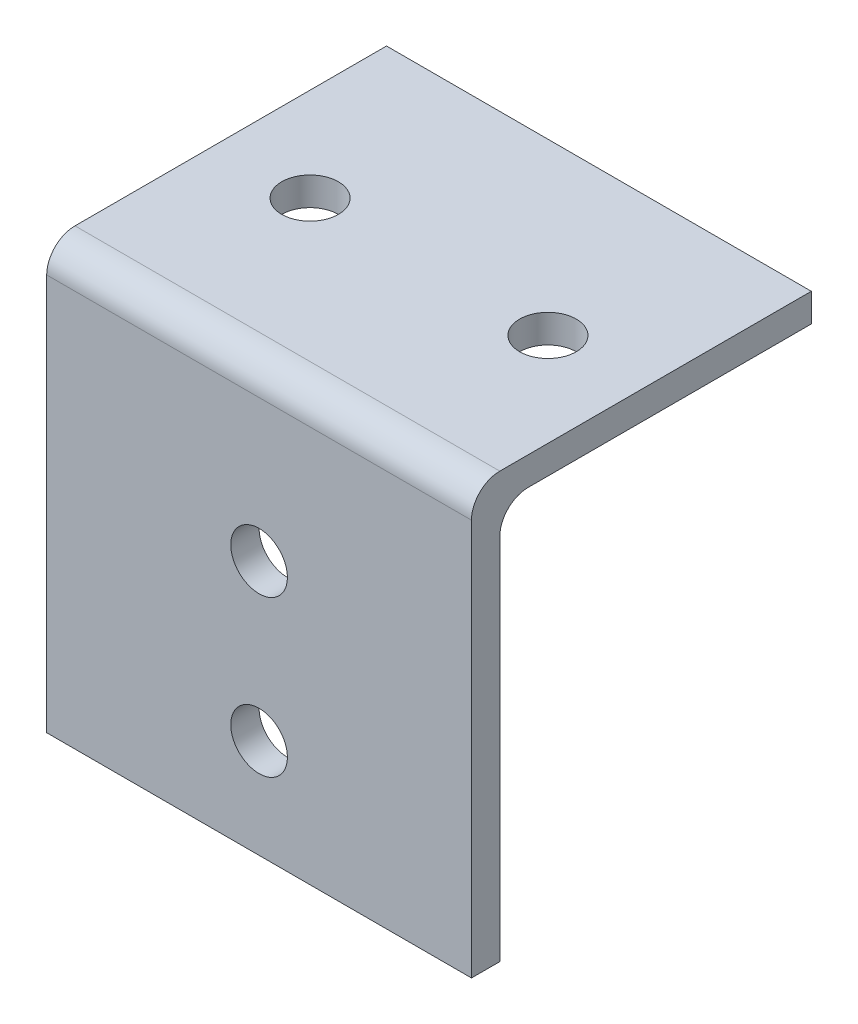
ISO-10303-21;
HEADER;
FILE_DESCRIPTION(('STEP AP214'),'2;1');
FILE_NAME('part.step','',(''),(''),'','','');
FILE_SCHEMA(('AUTOMOTIVE_DESIGN { 1 0 10303 214 1 1 1 1 }'));
ENDSEC;
DATA;
#1=APPLICATION_CONTEXT('core data for automotive mechanical design processes');
#2=APPLICATION_PROTOCOL_DEFINITION('international standard','automotive_design',2000,#1);
#3=PRODUCT_CONTEXT('',#1,'mechanical');
#4=PRODUCT('Part','Part','',(#3));
#5=PRODUCT_RELATED_PRODUCT_CATEGORY('part','',(#4));
#6=PRODUCT_DEFINITION_FORMATION('','',#4);
#7=PRODUCT_DEFINITION_CONTEXT('part definition',#1,'design');
#8=PRODUCT_DEFINITION('design','',#6,#7);
#9=PRODUCT_DEFINITION_SHAPE('','',#8);
#10=(LENGTH_UNIT() NAMED_UNIT(*) SI_UNIT(.MILLI.,.METRE.));
#11=(NAMED_UNIT(*) PLANE_ANGLE_UNIT() SI_UNIT($,.RADIAN.));
#12=(NAMED_UNIT(*) SI_UNIT($,.STERADIAN.) SOLID_ANGLE_UNIT());
#13=UNCERTAINTY_MEASURE_WITH_UNIT(LENGTH_MEASURE(1.E-05),#10,'distance_accuracy_value','');
#14=(GEOMETRIC_REPRESENTATION_CONTEXT(3) GLOBAL_UNCERTAINTY_ASSIGNED_CONTEXT((#13)) GLOBAL_UNIT_ASSIGNED_CONTEXT((#10,
#11,#12)) REPRESENTATION_CONTEXT('',''));
#15=CARTESIAN_POINT('',(0.,0.,0.));
#16=DIRECTION('',(0.,0.,1.));
#17=DIRECTION('',(1.,0.,0.));
#18=AXIS2_PLACEMENT_3D('',#15,#16,#17);
#19=CARTESIAN_POINT('',(0.,2.54,0.));
#20=DIRECTION('',(0.,1.,0.));
#21=DIRECTION('',(0.,0.,1.));
#22=AXIS2_PLACEMENT_3D('',#19,#20,#21);
#23=PLANE('',#22);
#24=CARTESIAN_POINT('',(-11.2013640387052,2.54,1.00923186480965));
#25=DIRECTION('',(0.,1.,0.));
#26=DIRECTION('',(0.,0.,1.));
#27=AXIS2_PLACEMENT_3D('',#24,#25,#26);
#28=CIRCLE('',#27,2.54);
#29=CARTESIAN_POINT('',(-11.2013640387052,2.54,3.54923186480965));
#30=VERTEX_POINT('',#29);
#31=EDGE_CURVE('E136',#30,#30,#28,.T.);
#32=ORIENTED_EDGE('',*,*,#31,.F.);
#33=EDGE_LOOP('',(#32));
#34=FACE_BOUND('',#33,.T.);
#35=DIRECTION('',(0.,0.,1.));
#36=VECTOR('',#35,1.);
#37=CARTESIAN_POINT('',(-19.5833640387052,2.54,-14.2307681351903));
#38=LINE('',#37,#36);
#39=CARTESIAN_POINT('',(-19.5833640387052,2.54,-14.2307681351903));
#40=VERTEX_POINT('',#39);
#41=CARTESIAN_POINT('',(-19.5833640387052,2.54,13.7092318648097));
#42=VERTEX_POINT('',#41);
#43=EDGE_CURVE('E147',#40,#42,#38,.T.);
#44=ORIENTED_EDGE('',*,*,#43,.T.);
#45=DIRECTION('',(-1.,0.,0.));
#46=VECTOR('',#45,1.);
#47=CARTESIAN_POINT('',(0.,2.54,13.7092318648097));
#48=LINE('',#47,#46);
#49=CARTESIAN_POINT('',(18.5166359612948,2.54,13.7092318648097));
#50=VERTEX_POINT('',#49);
#51=EDGE_CURVE('E45',#42,#50,#48,.F.);
#52=ORIENTED_EDGE('',*,*,#51,.T.);
#53=DIRECTION('',(0.,0.,-1.));
#54=VECTOR('',#53,1.);
#55=CARTESIAN_POINT('',(18.5166359612948,2.54,-14.2307681351903));
#56=LINE('',#55,#54);
#57=CARTESIAN_POINT('',(18.5166359612948,2.54,-14.2307681351903));
#58=VERTEX_POINT('',#57);
#59=EDGE_CURVE('E142',#50,#58,#56,.T.);
#60=ORIENTED_EDGE('',*,*,#59,.T.);
#61=DIRECTION('',(-1.,0.,0.));
#62=VECTOR('',#61,1.);
#63=CARTESIAN_POINT('',(5.08,2.54,-14.2307681351903));
#64=LINE('',#63,#62);
#65=EDGE_CURVE('E144',#58,#40,#64,.T.);
#66=ORIENTED_EDGE('',*,*,#65,.T.);
#67=EDGE_LOOP('',(#44,#52,#60,#66));
#68=FACE_BOUND('',#67,.T.);
#69=CARTESIAN_POINT('',(10.1346359612948,2.54,1.00923186480966));
#70=DIRECTION('',(0.,1.,0.));
#71=DIRECTION('',(0.,0.,1.));
#72=AXIS2_PLACEMENT_3D('',#69,#70,#71);
#73=CIRCLE('',#72,2.54);
#74=CARTESIAN_POINT('',(10.1346359612948,2.54,3.54923186480966));
#75=VERTEX_POINT('',#74);
#76=EDGE_CURVE('E128',#75,#75,#73,.T.);
#77=ORIENTED_EDGE('',*,*,#76,.F.);
#78=EDGE_LOOP('',(#77));
#79=FACE_BOUND('',#78,.T.);
#80=ADVANCED_FACE('F37',(#34,#68,#79),#23,.T.);
#81=CARTESIAN_POINT('',(0.,0.,0.));
#82=DIRECTION('',(0.,1.,0.));
#83=DIRECTION('',(0.,0.,1.));
#84=AXIS2_PLACEMENT_3D('',#81,#82,#83);
#85=PLANE('',#84);
#86=DIRECTION('',(0.,0.,-1.));
#87=VECTOR('',#86,1.);
#88=CARTESIAN_POINT('',(18.5166359612948,0.,-14.2307681351903));
#89=LINE('',#88,#87);
#90=CARTESIAN_POINT('',(18.5166359612948,0.,11.1692318648097));
#91=VERTEX_POINT('',#90);
#92=CARTESIAN_POINT('',(18.5166359612948,0.,-14.2307681351903));
#93=VERTEX_POINT('',#92);
#94=EDGE_CURVE('E139',#91,#93,#89,.T.);
#95=ORIENTED_EDGE('',*,*,#94,.F.);
#96=DIRECTION('',(1.,0.,0.));
#97=VECTOR('',#96,1.);
#98=CARTESIAN_POINT('',(-19.5833640387052,0.,11.1692318648097));
#99=LINE('',#98,#97);
#100=CARTESIAN_POINT('',(-19.5833640387052,0.,11.1692318648097));
#101=VERTEX_POINT('',#100);
#102=EDGE_CURVE('E163',#91,#101,#99,.F.);
#103=ORIENTED_EDGE('',*,*,#102,.T.);
#104=DIRECTION('',(0.,0.,1.));
#105=VECTOR('',#104,1.);
#106=CARTESIAN_POINT('',(-19.5833640387052,0.,-14.2307681351903));
#107=LINE('',#106,#105);
#108=CARTESIAN_POINT('',(-19.5833640387052,0.,-14.2307681351903));
#109=VERTEX_POINT('',#108);
#110=EDGE_CURVE('E145',#109,#101,#107,.T.);
#111=ORIENTED_EDGE('',*,*,#110,.F.);
#112=DIRECTION('',(-1.,0.,0.));
#113=VECTOR('',#112,1.);
#114=CARTESIAN_POINT('',(-19.5833640387052,0.,-14.2307681351903));
#115=LINE('',#114,#113);
#116=EDGE_CURVE('E151',#93,#109,#115,.T.);
#117=ORIENTED_EDGE('',*,*,#116,.F.);
#118=EDGE_LOOP('',(#95,#103,#111,#117));
#119=FACE_BOUND('',#118,.T.);
#120=CARTESIAN_POINT('',(-11.2013640387052,0.,1.00923186480965));
#121=DIRECTION('',(0.,1.,0.));
#122=DIRECTION('',(0.,0.,1.));
#123=AXIS2_PLACEMENT_3D('',#120,#121,#122);
#124=CIRCLE('',#123,2.54);
#125=CARTESIAN_POINT('',(-11.2013640387052,0.,3.54923186480965));
#126=VERTEX_POINT('',#125);
#127=EDGE_CURVE('E134',#126,#126,#124,.T.);
#128=ORIENTED_EDGE('',*,*,#127,.T.);
#129=EDGE_LOOP('',(#128));
#130=FACE_BOUND('',#129,.T.);
#131=CARTESIAN_POINT('',(10.1346359612948,0.,1.00923186480966));
#132=DIRECTION('',(0.,1.,0.));
#133=DIRECTION('',(0.,0.,1.));
#134=AXIS2_PLACEMENT_3D('',#131,#132,#133);
#135=CIRCLE('',#134,2.54);
#136=CARTESIAN_POINT('',(10.1346359612948,0.,3.54923186480966));
#137=VERTEX_POINT('',#136);
#138=EDGE_CURVE('E125',#137,#137,#135,.T.);
#139=ORIENTED_EDGE('',*,*,#138,.T.);
#140=EDGE_LOOP('',(#139));
#141=FACE_BOUND('',#140,.T.);
#142=ADVANCED_FACE('F189',(#119,#130,#141),#85,.F.);
#143=CARTESIAN_POINT('',(18.5166359612948,2.54,-14.2307681351903));
#144=DIRECTION('',(-1.,0.,0.));
#145=DIRECTION('',(0.,0.,1.));
#146=AXIS2_PLACEMENT_3D('',#143,#144,#145);
#147=PLANE('',#146);
#148=ORIENTED_EDGE('',*,*,#59,.F.);
#149=CARTESIAN_POINT('',(18.5166359612948,0.,13.7092318648097));
#150=DIRECTION('',(-1.,0.,0.));
#151=DIRECTION('',(0.,0.,1.));
#152=AXIS2_PLACEMENT_3D('',#149,#150,#151);
#153=CIRCLE('',#152,2.54);
#154=CARTESIAN_POINT('',(18.5166359612948,0.,16.2492318648097));
#155=VERTEX_POINT('',#154);
#156=EDGE_CURVE('E11',#50,#155,#153,.F.);
#157=ORIENTED_EDGE('',*,*,#156,.T.);
#158=DIRECTION('',(0.,1.,0.));
#159=VECTOR('',#158,1.);
#160=CARTESIAN_POINT('',(18.5166359612948,2.54,16.2492318648097));
#161=LINE('',#160,#159);
#162=CARTESIAN_POINT('',(18.5166359612948,-35.56,16.2492318648097));
#163=VERTEX_POINT('',#162);
#164=EDGE_CURVE('E119',#163,#155,#161,.T.);
#165=ORIENTED_EDGE('',*,*,#164,.F.);
#166=DIRECTION('',(0.,0.,-1.));
#167=VECTOR('',#166,1.);
#168=CARTESIAN_POINT('',(18.5166359612948,-35.56,16.2492318648097));
#169=LINE('',#168,#167);
#170=CARTESIAN_POINT('',(18.5166359612948,-35.56,13.7092318648097));
#171=VERTEX_POINT('',#170);
#172=EDGE_CURVE('E117',#163,#171,#169,.T.);
#173=ORIENTED_EDGE('',*,*,#172,.T.);
#174=DIRECTION('',(0.,1.,0.));
#175=VECTOR('',#174,1.);
#176=CARTESIAN_POINT('',(18.5166359612948,2.54,13.7092318648097));
#177=LINE('',#176,#175);
#178=CARTESIAN_POINT('',(18.5166359612948,-2.54,13.7092318648097));
#179=VERTEX_POINT('',#178);
#180=EDGE_CURVE('E110',#171,#179,#177,.T.);
#181=ORIENTED_EDGE('',*,*,#180,.T.);
#182=CARTESIAN_POINT('',(18.5166359612948,-2.54,11.1692318648097));
#183=DIRECTION('',(-1.,0.,0.));
#184=DIRECTION('',(0.,0.,1.));
#185=AXIS2_PLACEMENT_3D('',#182,#183,#184);
#186=CIRCLE('',#185,2.54);
#187=EDGE_CURVE('E165',#179,#91,#186,.T.);
#188=ORIENTED_EDGE('',*,*,#187,.T.);
#189=ORIENTED_EDGE('',*,*,#94,.T.);
#190=DIRECTION('',(0.,-1.,0.));
#191=VECTOR('',#190,1.);
#192=CARTESIAN_POINT('',(18.5166359612948,2.54,-14.2307681351903));
#193=LINE('',#192,#191);
#194=EDGE_CURVE('E157',#58,#93,#193,.T.);
#195=ORIENTED_EDGE('',*,*,#194,.F.);
#196=EDGE_LOOP('',(#148,#157,#165,#173,#181,#188,#189,#195));
#197=FACE_BOUND('',#196,.T.);
#198=ADVANCED_FACE('F185',(#197),#147,.F.);
#199=CARTESIAN_POINT('',(-19.5833640387052,2.54,-14.2307681351903));
#200=DIRECTION('',(0.,0.,1.));
#201=DIRECTION('',(1.,0.,0.));
#202=AXIS2_PLACEMENT_3D('',#199,#200,#201);
#203=PLANE('',#202);
#204=ORIENTED_EDGE('',*,*,#116,.T.);
#205=DIRECTION('',(0.,-1.,0.));
#206=VECTOR('',#205,1.);
#207=CARTESIAN_POINT('',(-19.5833640387052,2.54,-14.2307681351903));
#208=LINE('',#207,#206);
#209=EDGE_CURVE('E149',#40,#109,#208,.T.);
#210=ORIENTED_EDGE('',*,*,#209,.F.);
#211=ORIENTED_EDGE('',*,*,#65,.F.);
#212=ORIENTED_EDGE('',*,*,#194,.T.);
#213=EDGE_LOOP('',(#204,#210,#211,#212));
#214=FACE_BOUND('',#213,.T.);
#215=ADVANCED_FACE('F194',(#214),#203,.F.);
#216=CARTESIAN_POINT('',(-19.5833640387052,2.54,-14.2307681351903));
#217=DIRECTION('',(1.,0.,0.));
#218=DIRECTION('',(0.,0.,-1.));
#219=AXIS2_PLACEMENT_3D('',#216,#217,#218);
#220=PLANE('',#219);
#221=DIRECTION('',(0.,-1.,0.));
#222=VECTOR('',#221,1.);
#223=CARTESIAN_POINT('',(-19.5833640387052,2.54,16.2492318648097));
#224=LINE('',#223,#222);
#225=CARTESIAN_POINT('',(-19.5833640387052,0.,16.2492318648097));
#226=VERTEX_POINT('',#225);
#227=CARTESIAN_POINT('',(-19.5833640387052,-35.56,16.2492318648097));
#228=VERTEX_POINT('',#227);
#229=EDGE_CURVE('E100',#226,#228,#224,.T.);
#230=ORIENTED_EDGE('',*,*,#229,.F.);
#231=CARTESIAN_POINT('',(-19.5833640387052,0.,13.7092318648097));
#232=DIRECTION('',(1.,0.,0.));
#233=DIRECTION('',(0.,0.,-1.));
#234=AXIS2_PLACEMENT_3D('',#231,#232,#233);
#235=CIRCLE('',#234,2.54);
#236=EDGE_CURVE('E59',#226,#42,#235,.F.);
#237=ORIENTED_EDGE('',*,*,#236,.T.);
#238=ORIENTED_EDGE('',*,*,#43,.F.);
#239=ORIENTED_EDGE('',*,*,#209,.T.);
#240=ORIENTED_EDGE('',*,*,#110,.T.);
#241=CARTESIAN_POINT('',(-19.5833640387052,-2.54,11.1692318648097));
#242=DIRECTION('',(1.,0.,0.));
#243=DIRECTION('',(0.,0.,-1.));
#244=AXIS2_PLACEMENT_3D('',#241,#242,#243);
#245=CIRCLE('',#244,2.54);
#246=CARTESIAN_POINT('',(-19.5833640387052,-2.54,13.7092318648097));
#247=VERTEX_POINT('',#246);
#248=EDGE_CURVE('E167',#101,#247,#245,.T.);
#249=ORIENTED_EDGE('',*,*,#248,.T.);
#250=DIRECTION('',(0.,-1.,0.));
#251=VECTOR('',#250,1.);
#252=CARTESIAN_POINT('',(-19.5833640387052,2.54,13.7092318648097));
#253=LINE('',#252,#251);
#254=CARTESIAN_POINT('',(-19.5833640387052,-35.56,13.7092318648097));
#255=VERTEX_POINT('',#254);
#256=EDGE_CURVE('E123',#247,#255,#253,.T.);
#257=ORIENTED_EDGE('',*,*,#256,.T.);
#258=DIRECTION('',(0.,0.,-1.));
#259=VECTOR('',#258,1.);
#260=CARTESIAN_POINT('',(-19.5833640387052,-35.56,16.2492318648097));
#261=LINE('',#260,#259);
#262=EDGE_CURVE('E115',#228,#255,#261,.T.);
#263=ORIENTED_EDGE('',*,*,#262,.F.);
#264=EDGE_LOOP('',(#230,#237,#238,#239,#240,#249,#257,#263));
#265=FACE_BOUND('',#264,.T.);
#266=ADVANCED_FACE('F121',(#265),#220,.F.);
#267=CARTESIAN_POINT('',(-11.2013640387052,2.54,1.00923186480965));
#268=DIRECTION('',(0.,-1.,0.));
#269=DIRECTION('',(0.,0.,-1.));
#270=AXIS2_PLACEMENT_3D('',#267,#268,#269);
#271=CYLINDRICAL_SURFACE('',#270,2.54);
#272=ORIENTED_EDGE('',*,*,#31,.T.);
#273=EDGE_LOOP('',(#272));
#274=FACE_BOUND('',#273,.T.);
#275=ORIENTED_EDGE('',*,*,#127,.F.);
#276=EDGE_LOOP('',(#275));
#277=FACE_BOUND('',#276,.T.);
#278=ADVANCED_FACE('F211',(#274,#277),#271,.F.);
#279=CARTESIAN_POINT('',(10.1346359612948,2.54,1.00923186480966));
#280=DIRECTION('',(0.,-1.,0.));
#281=DIRECTION('',(0.,0.,-1.));
#282=AXIS2_PLACEMENT_3D('',#279,#280,#281);
#283=CYLINDRICAL_SURFACE('',#282,2.54);
#284=ORIENTED_EDGE('',*,*,#76,.T.);
#285=EDGE_LOOP('',(#284));
#286=FACE_BOUND('',#285,.T.);
#287=ORIENTED_EDGE('',*,*,#138,.F.);
#288=EDGE_LOOP('',(#287));
#289=FACE_BOUND('',#288,.T.);
#290=ADVANCED_FACE('F238',(#286,#289),#283,.F.);
#291=CARTESIAN_POINT('',(0.,0.,13.7092318648097));
#292=DIRECTION('',(0.,0.,1.));
#293=DIRECTION('',(1.,0.,0.));
#294=AXIS2_PLACEMENT_3D('',#291,#292,#293);
#295=PLANE('',#294);
#296=CARTESIAN_POINT('',(-0.533364038705207,-12.7,13.7092318648097));
#297=DIRECTION('',(0.,0.,1.));
#298=DIRECTION('',(1.,0.,0.));
#299=AXIS2_PLACEMENT_3D('',#296,#297,#298);
#300=CIRCLE('',#299,2.54);
#301=CARTESIAN_POINT('',(2.00663596129479,-12.7,13.7092318648097));
#302=VERTEX_POINT('',#301);
#303=EDGE_CURVE('E377',#302,#302,#300,.T.);
#304=ORIENTED_EDGE('',*,*,#303,.T.);
#305=EDGE_LOOP('',(#304));
#306=FACE_BOUND('',#305,.T.);
#307=CARTESIAN_POINT('',(-0.533364038705207,-26.67,13.7092318648097));
#308=DIRECTION('',(0.,0.,1.));
#309=DIRECTION('',(1.,0.,0.));
#310=AXIS2_PLACEMENT_3D('',#307,#308,#309);
#311=CIRCLE('',#310,2.54);
#312=CARTESIAN_POINT('',(2.0066359612948,-26.67,13.7092318648097));
#313=VERTEX_POINT('',#312);
#314=EDGE_CURVE('E374',#313,#313,#311,.T.);
#315=ORIENTED_EDGE('',*,*,#314,.T.);
#316=EDGE_LOOP('',(#315));
#317=FACE_BOUND('',#316,.T.);
#318=ORIENTED_EDGE('',*,*,#256,.F.);
#319=DIRECTION('',(1.,0.,0.));
#320=VECTOR('',#319,1.);
#321=CARTESIAN_POINT('',(18.5166359612948,-2.54,13.7092318648097));
#322=LINE('',#321,#320);
#323=EDGE_CURVE('E160',#247,#179,#322,.T.);
#324=ORIENTED_EDGE('',*,*,#323,.T.);
#325=ORIENTED_EDGE('',*,*,#180,.F.);
#326=DIRECTION('',(1.,0.,0.));
#327=VECTOR('',#326,1.);
#328=CARTESIAN_POINT('',(-19.5833640387052,-35.56,13.7092318648097));
#329=LINE('',#328,#327);
#330=EDGE_CURVE('E179',#255,#171,#329,.T.);
#331=ORIENTED_EDGE('',*,*,#330,.F.);
#332=EDGE_LOOP('',(#318,#324,#325,#331));
#333=FACE_BOUND('',#332,.T.);
#334=ADVANCED_FACE('F176',(#306,#317,#333),#295,.F.);
#335=CARTESIAN_POINT('',(0.,0.,16.2492318648097));
#336=DIRECTION('',(0.,0.,1.));
#337=DIRECTION('',(1.,0.,0.));
#338=AXIS2_PLACEMENT_3D('',#335,#336,#337);
#339=PLANE('',#338);
#340=CARTESIAN_POINT('',(-0.533364038705207,-12.7,16.2492318648097));
#341=DIRECTION('',(0.,0.,1.));
#342=DIRECTION('',(1.,0.,0.));
#343=AXIS2_PLACEMENT_3D('',#340,#341,#342);
#344=CIRCLE('',#343,2.54);
#345=CARTESIAN_POINT('',(2.00663596129479,-12.7,16.2492318648097));
#346=VERTEX_POINT('',#345);
#347=EDGE_CURVE('E180',#346,#346,#344,.T.);
#348=ORIENTED_EDGE('',*,*,#347,.F.);
#349=EDGE_LOOP('',(#348));
#350=FACE_BOUND('',#349,.T.);
#351=ORIENTED_EDGE('',*,*,#164,.T.);
#352=DIRECTION('',(-1.,0.,0.));
#353=VECTOR('',#352,1.);
#354=CARTESIAN_POINT('',(0.,0.,16.2492318648097));
#355=LINE('',#354,#353);
#356=EDGE_CURVE('E108',#155,#226,#355,.T.);
#357=ORIENTED_EDGE('',*,*,#356,.T.);
#358=ORIENTED_EDGE('',*,*,#229,.T.);
#359=DIRECTION('',(1.,0.,0.));
#360=VECTOR('',#359,1.);
#361=CARTESIAN_POINT('',(-19.5833640387052,-35.56,16.2492318648097));
#362=LINE('',#361,#360);
#363=EDGE_CURVE('E105',#228,#163,#362,.T.);
#364=ORIENTED_EDGE('',*,*,#363,.T.);
#365=EDGE_LOOP('',(#351,#357,#358,#364));
#366=FACE_BOUND('',#365,.T.);
#367=CARTESIAN_POINT('',(-0.533364038705207,-26.67,16.2492318648097));
#368=DIRECTION('',(0.,0.,1.));
#369=DIRECTION('',(1.,0.,0.));
#370=AXIS2_PLACEMENT_3D('',#367,#368,#369);
#371=CIRCLE('',#370,2.54);
#372=CARTESIAN_POINT('',(2.0066359612948,-26.67,16.2492318648097));
#373=VERTEX_POINT('',#372);
#374=EDGE_CURVE('E371',#373,#373,#371,.T.);
#375=ORIENTED_EDGE('',*,*,#374,.F.);
#376=EDGE_LOOP('',(#375));
#377=FACE_BOUND('',#376,.T.);
#378=ADVANCED_FACE('F103',(#350,#366,#377),#339,.T.);
#379=CARTESIAN_POINT('',(-19.5833640387052,-35.56,16.2492318648097));
#380=DIRECTION('',(0.,1.,0.));
#381=DIRECTION('',(-1.,0.,0.));
#382=AXIS2_PLACEMENT_3D('',#379,#380,#381);
#383=PLANE('',#382);
#384=ORIENTED_EDGE('',*,*,#330,.T.);
#385=ORIENTED_EDGE('',*,*,#172,.F.);
#386=ORIENTED_EDGE('',*,*,#363,.F.);
#387=ORIENTED_EDGE('',*,*,#262,.T.);
#388=EDGE_LOOP('',(#384,#385,#386,#387));
#389=FACE_BOUND('',#388,.T.);
#390=ADVANCED_FACE('F114',(#389),#383,.F.);
#391=CARTESIAN_POINT('',(-0.533364038705207,-12.7,16.2492318648097));
#392=DIRECTION('',(0.,0.,-1.));
#393=DIRECTION('',(-1.,0.,0.));
#394=AXIS2_PLACEMENT_3D('',#391,#392,#393);
#395=CYLINDRICAL_SURFACE('',#394,2.54);
#396=ORIENTED_EDGE('',*,*,#347,.T.);
#397=EDGE_LOOP('',(#396));
#398=FACE_BOUND('',#397,.T.);
#399=ORIENTED_EDGE('',*,*,#303,.F.);
#400=EDGE_LOOP('',(#399));
#401=FACE_BOUND('',#400,.T.);
#402=ADVANCED_FACE('F265',(#398,#401),#395,.F.);
#403=CARTESIAN_POINT('',(-0.533364038705207,-26.67,16.2492318648097));
#404=DIRECTION('',(0.,0.,-1.));
#405=DIRECTION('',(-1.,0.,0.));
#406=AXIS2_PLACEMENT_3D('',#403,#404,#405);
#407=CYLINDRICAL_SURFACE('',#406,2.54);
#408=ORIENTED_EDGE('',*,*,#374,.T.);
#409=EDGE_LOOP('',(#408));
#410=FACE_BOUND('',#409,.T.);
#411=ORIENTED_EDGE('',*,*,#314,.F.);
#412=EDGE_LOOP('',(#411));
#413=FACE_BOUND('',#412,.T.);
#414=ADVANCED_FACE('F201',(#410,#413),#407,.F.);
#415=CARTESIAN_POINT('',(0.,-2.54,11.1692318648097));
#416=DIRECTION('',(-1.,0.,0.));
#417=DIRECTION('',(0.,0.,1.));
#418=AXIS2_PLACEMENT_3D('',#415,#416,#417);
#419=CYLINDRICAL_SURFACE('',#418,2.54);
#420=ORIENTED_EDGE('',*,*,#248,.F.);
#421=ORIENTED_EDGE('',*,*,#102,.F.);
#422=ORIENTED_EDGE('',*,*,#187,.F.);
#423=ORIENTED_EDGE('',*,*,#323,.F.);
#424=EDGE_LOOP('',(#420,#421,#422,#423));
#425=FACE_BOUND('',#424,.T.);
#426=ADVANCED_FACE('F182',(#425),#419,.F.);
#427=CARTESIAN_POINT('',(0.,0.,13.7092318648097));
#428=DIRECTION('',(-1.,0.,0.));
#429=DIRECTION('',(0.,0.,1.));
#430=AXIS2_PLACEMENT_3D('',#427,#428,#429);
#431=CYLINDRICAL_SURFACE('',#430,2.54);
#432=ORIENTED_EDGE('',*,*,#156,.F.);
#433=ORIENTED_EDGE('',*,*,#51,.F.);
#434=ORIENTED_EDGE('',*,*,#236,.F.);
#435=ORIENTED_EDGE('',*,*,#356,.F.);
#436=EDGE_LOOP('',(#432,#433,#434,#435));
#437=FACE_BOUND('',#436,.T.);
#438=ADVANCED_FACE('F39',(#437),#431,.T.);
#439=CLOSED_SHELL('',(#80,#142,#198,#215,#266,#278,#290,#334,#378,#390,#402,#414,#426,#438));
#440=MANIFOLD_SOLID_BREP('B2',#439);
#441=ADVANCED_BREP_SHAPE_REPRESENTATION('',(#18,#440),#14);
#442=SHAPE_DEFINITION_REPRESENTATION(#9,#441);
ENDSEC;
END-ISO-10303-21;
